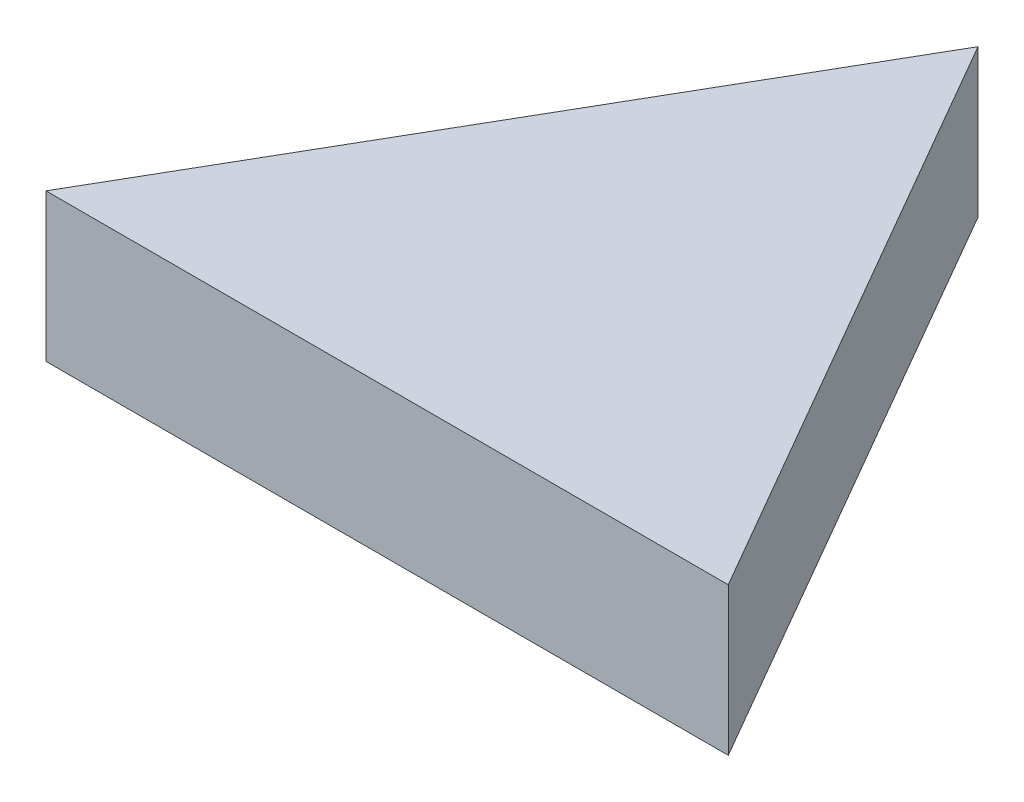
ISO-10303-21;
HEADER;
FILE_DESCRIPTION(('STEP AP214'),'2;1');
FILE_NAME('part.step','',(''),(''),'','','');
FILE_SCHEMA(('AUTOMOTIVE_DESIGN { 1 0 10303 214 1 1 1 1 }'));
ENDSEC;
DATA;
#1=APPLICATION_CONTEXT('core data for automotive mechanical design processes');
#2=APPLICATION_PROTOCOL_DEFINITION('international standard','automotive_design',2000,#1);
#3=PRODUCT_CONTEXT('',#1,'mechanical');
#4=PRODUCT('Part','Part','',(#3));
#5=PRODUCT_RELATED_PRODUCT_CATEGORY('part','',(#4));
#6=PRODUCT_DEFINITION_FORMATION('','',#4);
#7=PRODUCT_DEFINITION_CONTEXT('part definition',#1,'design');
#8=PRODUCT_DEFINITION('design','',#6,#7);
#9=PRODUCT_DEFINITION_SHAPE('','',#8);
#10=(LENGTH_UNIT() NAMED_UNIT(*) SI_UNIT(.MILLI.,.METRE.));
#11=(NAMED_UNIT(*) PLANE_ANGLE_UNIT() SI_UNIT($,.RADIAN.));
#12=(NAMED_UNIT(*) SI_UNIT($,.STERADIAN.) SOLID_ANGLE_UNIT());
#13=UNCERTAINTY_MEASURE_WITH_UNIT(LENGTH_MEASURE(1.E-05),#10,'distance_accuracy_value','');
#14=(GEOMETRIC_REPRESENTATION_CONTEXT(3) GLOBAL_UNCERTAINTY_ASSIGNED_CONTEXT((#13)) GLOBAL_UNIT_ASSIGNED_CONTEXT((#10,
#11,#12)) REPRESENTATION_CONTEXT('',''));
#15=CARTESIAN_POINT('',(0.,0.,0.));
#16=DIRECTION('',(0.,0.,1.));
#17=DIRECTION('',(1.,0.,0.));
#18=AXIS2_PLACEMENT_3D('',#15,#16,#17);
#19=CARTESIAN_POINT('',(14.6646968374166,6.35,8.46666666666654));
#20=DIRECTION('',(-0.866025403784436,0.,0.500000000000004));
#21=DIRECTION('',(0.500000000000004,0.,0.866025403784436));
#22=AXIS2_PLACEMENT_3D('',#19,#20,#21);
#23=PLANE('',#22);
#24=DIRECTION('',(-0.500000000000004,0.,-0.866025403784436));
#25=VECTOR('',#24,1.);
#26=CARTESIAN_POINT('',(14.6646968374166,0.,8.46666666666654));
#27=LINE('',#26,#25);
#28=CARTESIAN_POINT('',(14.6646968374166,0.,8.46666666666654));
#29=VERTEX_POINT('',#28);
#30=CARTESIAN_POINT('',(0.,0.,-16.9333333333334));
#31=VERTEX_POINT('',#30);
#32=EDGE_CURVE('E89',#29,#31,#27,.T.);
#33=ORIENTED_EDGE('',*,*,#32,.T.);
#34=DIRECTION('',(0.,-1.,0.));
#35=VECTOR('',#34,1.);
#36=CARTESIAN_POINT('',(0.,6.35,-16.9333333333334));
#37=LINE('',#36,#35);
#38=CARTESIAN_POINT('',(0.,6.35,-16.9333333333334));
#39=VERTEX_POINT('',#38);
#40=EDGE_CURVE('E11',#39,#31,#37,.T.);
#41=ORIENTED_EDGE('',*,*,#40,.F.);
#42=DIRECTION('',(-0.500000000000004,0.,-0.866025403784436));
#43=VECTOR('',#42,1.);
#44=CARTESIAN_POINT('',(14.6646968374166,6.35,8.46666666666654));
#45=LINE('',#44,#43);
#46=CARTESIAN_POINT('',(14.6646968374166,6.35,8.46666666666654));
#47=VERTEX_POINT('',#46);
#48=EDGE_CURVE('E81',#47,#39,#45,.T.);
#49=ORIENTED_EDGE('',*,*,#48,.F.);
#50=DIRECTION('',(0.,-1.,0.));
#51=VECTOR('',#50,1.);
#52=CARTESIAN_POINT('',(14.6646968374166,6.35,8.46666666666654));
#53=LINE('',#52,#51);
#54=EDGE_CURVE('E90',#47,#29,#53,.T.);
#55=ORIENTED_EDGE('',*,*,#54,.T.);
#56=EDGE_LOOP('',(#33,#41,#49,#55));
#57=FACE_BOUND('',#56,.T.);
#58=ADVANCED_FACE('F39',(#57),#23,.F.);
#59=CARTESIAN_POINT('',(0.,6.35,-16.9333333333334));
#60=DIRECTION('',(0.86602540378444,0.,0.499999999999998));
#61=DIRECTION('',(0.499999999999998,0.,-0.86602540378444));
#62=AXIS2_PLACEMENT_3D('',#59,#60,#61);
#63=PLANE('',#62);
#64=DIRECTION('',(-0.499999999999998,0.,0.86602540378444));
#65=VECTOR('',#64,1.);
#66=CARTESIAN_POINT('',(0.,0.,-16.9333333333334));
#67=LINE('',#66,#65);
#68=CARTESIAN_POINT('',(-14.6646968374165,0.,8.46666666666674));
#69=VERTEX_POINT('',#68);
#70=EDGE_CURVE('E68',#31,#69,#67,.T.);
#71=ORIENTED_EDGE('',*,*,#70,.T.);
#72=DIRECTION('',(0.,-1.,0.));
#73=VECTOR('',#72,1.);
#74=CARTESIAN_POINT('',(-14.6646968374165,6.35,8.46666666666674));
#75=LINE('',#74,#73);
#76=CARTESIAN_POINT('',(-14.6646968374165,6.35,8.46666666666674));
#77=VERTEX_POINT('',#76);
#78=EDGE_CURVE('E48',#77,#69,#75,.T.);
#79=ORIENTED_EDGE('',*,*,#78,.F.);
#80=DIRECTION('',(-0.499999999999998,0.,0.86602540378444));
#81=VECTOR('',#80,1.);
#82=CARTESIAN_POINT('',(0.,6.35,-16.9333333333334));
#83=LINE('',#82,#81);
#84=EDGE_CURVE('E76',#39,#77,#83,.T.);
#85=ORIENTED_EDGE('',*,*,#84,.F.);
#86=ORIENTED_EDGE('',*,*,#40,.T.);
#87=EDGE_LOOP('',(#71,#79,#85,#86));
#88=FACE_BOUND('',#87,.T.);
#89=ADVANCED_FACE('F77',(#88),#63,.F.);
#90=CARTESIAN_POINT('',(-14.6646968374165,6.35,8.46666666666674));
#91=DIRECTION('',(0.,0.,-1.));
#92=DIRECTION('',(-1.,0.,0.));
#93=AXIS2_PLACEMENT_3D('',#90,#91,#92);
#94=PLANE('',#93);
#95=DIRECTION('',(1.,0.,0.));
#96=VECTOR('',#95,1.);
#97=CARTESIAN_POINT('',(-14.6646968374165,0.,8.46666666666674));
#98=LINE('',#97,#96);
#99=EDGE_CURVE('E73',#69,#29,#98,.T.);
#100=ORIENTED_EDGE('',*,*,#99,.T.);
#101=ORIENTED_EDGE('',*,*,#54,.F.);
#102=DIRECTION('',(1.,0.,0.));
#103=VECTOR('',#102,1.);
#104=CARTESIAN_POINT('',(-14.6646968374165,6.35,8.46666666666674));
#105=LINE('',#104,#103);
#106=EDGE_CURVE('E56',#77,#47,#105,.T.);
#107=ORIENTED_EDGE('',*,*,#106,.F.);
#108=ORIENTED_EDGE('',*,*,#78,.T.);
#109=EDGE_LOOP('',(#100,#101,#107,#108));
#110=FACE_BOUND('',#109,.T.);
#111=ADVANCED_FACE('F102',(#110),#94,.F.);
#112=CARTESIAN_POINT('',(0.,6.35,0.));
#113=DIRECTION('',(0.,1.,0.));
#114=DIRECTION('',(0.,0.,1.));
#115=AXIS2_PLACEMENT_3D('',#112,#113,#114);
#116=PLANE('',#115);
#117=ORIENTED_EDGE('',*,*,#48,.T.);
#118=ORIENTED_EDGE('',*,*,#84,.T.);
#119=ORIENTED_EDGE('',*,*,#106,.T.);
#120=EDGE_LOOP('',(#117,#118,#119));
#121=FACE_BOUND('',#120,.T.);
#122=ADVANCED_FACE('F84',(#121),#116,.T.);
#123=CARTESIAN_POINT('',(0.,0.,0.));
#124=DIRECTION('',(0.,1.,0.));
#125=DIRECTION('',(0.,0.,1.));
#126=AXIS2_PLACEMENT_3D('',#123,#124,#125);
#127=PLANE('',#126);
#128=ORIENTED_EDGE('',*,*,#32,.F.);
#129=ORIENTED_EDGE('',*,*,#99,.F.);
#130=ORIENTED_EDGE('',*,*,#70,.F.);
#131=EDGE_LOOP('',(#128,#129,#130));
#132=FACE_BOUND('',#131,.T.);
#133=ADVANCED_FACE('F103',(#132),#127,.F.);
#134=CLOSED_SHELL('',(#58,#89,#111,#122,#133));
#135=MANIFOLD_SOLID_BREP('B2',#134);
#136=ADVANCED_BREP_SHAPE_REPRESENTATION('',(#18,#135),#14);
#137=SHAPE_DEFINITION_REPRESENTATION(#9,#136);
ENDSEC;
END-ISO-10303-21;
